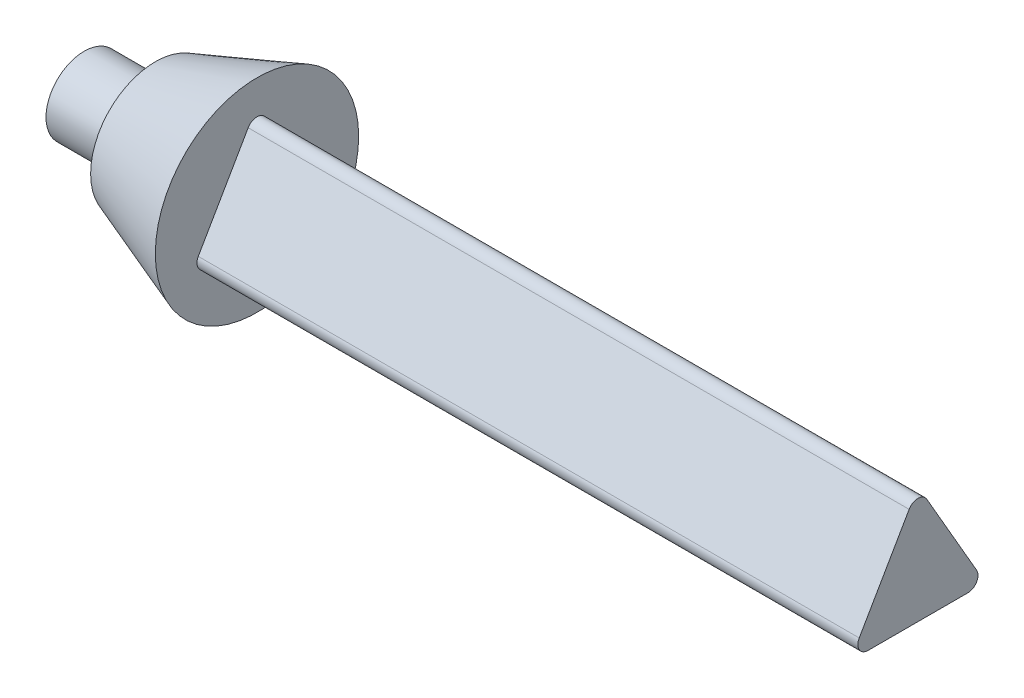
ISO-10303-21;
HEADER;
FILE_DESCRIPTION(('STEP AP214'),'2;1');
FILE_NAME('part.step','',(''),(''),'','','');
FILE_SCHEMA(('AUTOMOTIVE_DESIGN { 1 0 10303 214 1 1 1 1 }'));
ENDSEC;
DATA;
#1=APPLICATION_CONTEXT('core data for automotive mechanical design processes');
#2=APPLICATION_PROTOCOL_DEFINITION('international standard','automotive_design',2000,#1);
#3=PRODUCT_CONTEXT('',#1,'mechanical');
#4=PRODUCT('Part','Part','',(#3));
#5=PRODUCT_RELATED_PRODUCT_CATEGORY('part','',(#4));
#6=PRODUCT_DEFINITION_FORMATION('','',#4);
#7=PRODUCT_DEFINITION_CONTEXT('part definition',#1,'design');
#8=PRODUCT_DEFINITION('design','',#6,#7);
#9=PRODUCT_DEFINITION_SHAPE('','',#8);
#10=(LENGTH_UNIT() NAMED_UNIT(*) SI_UNIT(.MILLI.,.METRE.));
#11=(NAMED_UNIT(*) PLANE_ANGLE_UNIT() SI_UNIT($,.RADIAN.));
#12=(NAMED_UNIT(*) SI_UNIT($,.STERADIAN.) SOLID_ANGLE_UNIT());
#13=UNCERTAINTY_MEASURE_WITH_UNIT(LENGTH_MEASURE(1.E-05),#10,'distance_accuracy_value','');
#14=(GEOMETRIC_REPRESENTATION_CONTEXT(3) GLOBAL_UNCERTAINTY_ASSIGNED_CONTEXT((#13)) GLOBAL_UNIT_ASSIGNED_CONTEXT((#10,
#11,#12)) REPRESENTATION_CONTEXT('',''));
#15=CARTESIAN_POINT('',(0.,0.,0.));
#16=DIRECTION('',(0.,0.,1.));
#17=DIRECTION('',(1.,0.,0.));
#18=AXIS2_PLACEMENT_3D('',#15,#16,#17);
#19=CARTESIAN_POINT('',(0.,0.,0.));
#20=DIRECTION('',(-1.,0.,0.));
#21=DIRECTION('',(0.,0.,1.));
#22=AXIS2_PLACEMENT_3D('',#19,#20,#21);
#23=PLANE('',#22);
#24=CARTESIAN_POINT('',(0.,0.,0.));
#25=DIRECTION('',(-1.,0.,0.));
#26=DIRECTION('',(0.,0.,1.));
#27=AXIS2_PLACEMENT_3D('',#24,#25,#26);
#28=CIRCLE('',#27,2.);
#29=CARTESIAN_POINT('',(0.,0.,2.));
#30=VERTEX_POINT('',#29);
#31=EDGE_CURVE('E120',#30,#30,#28,.T.);
#32=ORIENTED_EDGE('',*,*,#31,.F.);
#33=EDGE_LOOP('',(#32));
#34=FACE_BOUND('',#33,.T.);
#35=DIRECTION('',(0.,0.866025403784438,0.5));
#36=VECTOR('',#35,1.);
#37=CARTESIAN_POINT('',(0.,-0.766666666666666,-1.32790561913614));
#38=LINE('',#37,#36);
#39=CARTESIAN_POINT('',(0.,-0.466666666666666,-1.15470053837925));
#40=VERTEX_POINT('',#39);
#41=CARTESIAN_POINT('',(0.,1.23333333333333,-0.173205080756888));
#42=VERTEX_POINT('',#41);
#43=EDGE_CURVE('E99',#40,#42,#38,.T.);
#44=ORIENTED_EDGE('',*,*,#43,.F.);
#45=CARTESIAN_POINT('',(0.,-0.566666666666666,-0.981495457622363));
#46=DIRECTION('',(-1.,0.,0.));
#47=DIRECTION('',(0.,0.,1.));
#48=AXIS2_PLACEMENT_3D('',#45,#46,#47);
#49=CIRCLE('',#48,0.2);
#50=CARTESIAN_POINT('',(0.,-0.766666666666666,-0.981495457622363));
#51=VERTEX_POINT('',#50);
#52=EDGE_CURVE('E85',#40,#51,#49,.T.);
#53=ORIENTED_EDGE('',*,*,#52,.T.);
#54=DIRECTION('',(0.,0.,-1.));
#55=VECTOR('',#54,1.);
#56=CARTESIAN_POINT('',(0.,-0.766666666666667,1.32790561913614));
#57=LINE('',#56,#55);
#58=CARTESIAN_POINT('',(0.,-0.766666666666666,0.981495457622363));
#59=VERTEX_POINT('',#58);
#60=EDGE_CURVE('E108',#59,#51,#57,.T.);
#61=ORIENTED_EDGE('',*,*,#60,.F.);
#62=CARTESIAN_POINT('',(0.,-0.566666666666667,0.981495457622363));
#63=DIRECTION('',(-1.,0.,0.));
#64=DIRECTION('',(0.,0.,1.));
#65=AXIS2_PLACEMENT_3D('',#62,#63,#64);
#66=CIRCLE('',#65,0.2);
#67=CARTESIAN_POINT('',(0.,-0.466666666666666,1.15470053837925));
#68=VERTEX_POINT('',#67);
#69=EDGE_CURVE('E11',#59,#68,#66,.T.);
#70=ORIENTED_EDGE('',*,*,#69,.T.);
#71=DIRECTION('',(0.,-0.866025403784439,0.5));
#72=VECTOR('',#71,1.);
#73=CARTESIAN_POINT('',(0.,1.53333333333333,0.));
#74=LINE('',#73,#72);
#75=CARTESIAN_POINT('',(0.,1.23333333333333,0.173205080756888));
#76=VERTEX_POINT('',#75);
#77=EDGE_CURVE('E105',#76,#68,#74,.T.);
#78=ORIENTED_EDGE('',*,*,#77,.F.);
#79=CARTESIAN_POINT('',(0.,1.13333333333333,0.));
#80=DIRECTION('',(-1.,0.,0.));
#81=DIRECTION('',(0.,0.,1.));
#82=AXIS2_PLACEMENT_3D('',#79,#80,#81);
#83=CIRCLE('',#82,0.2);
#84=EDGE_CURVE('E41',#76,#42,#83,.T.);
#85=ORIENTED_EDGE('',*,*,#84,.T.);
#86=EDGE_LOOP('',(#44,#53,#61,#70,#78,#85));
#87=FACE_BOUND('',#86,.T.);
#88=ADVANCED_FACE('F33',(#34,#87),#23,.F.);
#89=CARTESIAN_POINT('',(0.,0.,0.));
#90=DIRECTION('',(1.,0.,0.));
#91=DIRECTION('',(0.,0.,-1.));
#92=AXIS2_PLACEMENT_3D('',#89,#90,#91);
#93=CONICAL_SURFACE('',#92,2.,0.34906585039886);
#94=CARTESIAN_POINT('',(-2.,0.,0.));
#95=DIRECTION('',(-1.,0.,0.));
#96=DIRECTION('',(0.,0.,1.));
#97=AXIS2_PLACEMENT_3D('',#94,#95,#96);
#98=CIRCLE('',#97,1.27205953146761);
#99=CARTESIAN_POINT('',(-2.,0.,1.27205953146761));
#100=VERTEX_POINT('',#99);
#101=EDGE_CURVE('E117',#100,#100,#98,.T.);
#102=ORIENTED_EDGE('',*,*,#101,.F.);
#103=EDGE_LOOP('',(#102));
#104=FACE_BOUND('',#103,.T.);
#105=ORIENTED_EDGE('',*,*,#31,.T.);
#106=EDGE_LOOP('',(#105));
#107=FACE_BOUND('',#106,.T.);
#108=ADVANCED_FACE('F158',(#104,#107),#93,.T.);
#109=CARTESIAN_POINT('',(-2.,1.27205953146761,0.));
#110=DIRECTION('',(1.,0.,0.));
#111=DIRECTION('',(0.,0.,-1.));
#112=AXIS2_PLACEMENT_3D('',#109,#110,#111);
#113=PLANE('',#112);
#114=CARTESIAN_POINT('',(-2.,0.,0.));
#115=DIRECTION('',(-1.,0.,0.));
#116=DIRECTION('',(0.,0.,1.));
#117=AXIS2_PLACEMENT_3D('',#114,#115,#116);
#118=CIRCLE('',#117,0.75);
#119=CARTESIAN_POINT('',(-2.,0.,0.75));
#120=VERTEX_POINT('',#119);
#121=EDGE_CURVE('E123',#120,#120,#118,.T.);
#122=ORIENTED_EDGE('',*,*,#121,.F.);
#123=EDGE_LOOP('',(#122));
#124=FACE_BOUND('',#123,.T.);
#125=ORIENTED_EDGE('',*,*,#101,.T.);
#126=EDGE_LOOP('',(#125));
#127=FACE_BOUND('',#126,.T.);
#128=ADVANCED_FACE('F155',(#124,#127),#113,.F.);
#129=CARTESIAN_POINT('',(13.,-0.766666666666666,-1.32790561913614));
#130=DIRECTION('',(0.,-0.5,0.866025403784438));
#131=DIRECTION('',(0.,-0.866025403784439,-0.5));
#132=AXIS2_PLACEMENT_3D('',#129,#130,#131);
#133=PLANE('',#132);
#134=DIRECTION('',(0.,0.866025403784438,0.5));
#135=VECTOR('',#134,1.);
#136=CARTESIAN_POINT('',(13.,-0.766666666666666,-1.32790561913614));
#137=LINE('',#136,#135);
#138=CARTESIAN_POINT('',(13.,-0.466666666666666,-1.15470053837925));
#139=VERTEX_POINT('',#138);
#140=CARTESIAN_POINT('',(13.,1.23333333333333,-0.173205080756888));
#141=VERTEX_POINT('',#140);
#142=EDGE_CURVE('E101',#139,#141,#137,.T.);
#143=ORIENTED_EDGE('',*,*,#142,.F.);
#144=DIRECTION('',(-1.,0.,0.));
#145=VECTOR('',#144,1.);
#146=CARTESIAN_POINT('',(13.,-0.466666666666666,-1.15470053837925));
#147=LINE('',#146,#145);
#148=EDGE_CURVE('E89',#139,#40,#147,.T.);
#149=ORIENTED_EDGE('',*,*,#148,.T.);
#150=ORIENTED_EDGE('',*,*,#43,.T.);
#151=DIRECTION('',(-1.,0.,0.));
#152=VECTOR('',#151,1.);
#153=CARTESIAN_POINT('',(13.,1.23333333333333,-0.173205080756887));
#154=LINE('',#153,#152);
#155=EDGE_CURVE('E103',#42,#141,#154,.F.);
#156=ORIENTED_EDGE('',*,*,#155,.T.);
#157=EDGE_LOOP('',(#143,#149,#150,#156));
#158=FACE_BOUND('',#157,.T.);
#159=ADVANCED_FACE('F98',(#158),#133,.F.);
#160=CARTESIAN_POINT('',(13.,1.53333333333333,0.));
#161=DIRECTION('',(0.,-0.5,-0.866025403784439));
#162=DIRECTION('',(0.,0.866025403784439,-0.5));
#163=AXIS2_PLACEMENT_3D('',#160,#161,#162);
#164=PLANE('',#163);
#165=DIRECTION('',(0.,-0.866025403784439,0.5));
#166=VECTOR('',#165,1.);
#167=CARTESIAN_POINT('',(13.,1.53333333333333,0.));
#168=LINE('',#167,#166);
#169=CARTESIAN_POINT('',(13.,1.23333333333333,0.173205080756888));
#170=VERTEX_POINT('',#169);
#171=CARTESIAN_POINT('',(13.,-0.466666666666666,1.15470053837925));
#172=VERTEX_POINT('',#171);
#173=EDGE_CURVE('E141',#170,#172,#168,.T.);
#174=ORIENTED_EDGE('',*,*,#173,.F.);
#175=DIRECTION('',(-1.,0.,0.));
#176=VECTOR('',#175,1.);
#177=CARTESIAN_POINT('',(13.,1.23333333333333,0.173205080756888));
#178=LINE('',#177,#176);
#179=EDGE_CURVE('E93',#170,#76,#178,.T.);
#180=ORIENTED_EDGE('',*,*,#179,.T.);
#181=ORIENTED_EDGE('',*,*,#77,.T.);
#182=DIRECTION('',(-1.,0.,0.));
#183=VECTOR('',#182,1.);
#184=CARTESIAN_POINT('',(13.,-0.466666666666666,1.15470053837925));
#185=LINE('',#184,#183);
#186=EDGE_CURVE('E134',#68,#172,#185,.F.);
#187=ORIENTED_EDGE('',*,*,#186,.T.);
#188=EDGE_LOOP('',(#174,#180,#181,#187));
#189=FACE_BOUND('',#188,.T.);
#190=ADVANCED_FACE('F138',(#189),#164,.F.);
#191=CARTESIAN_POINT('',(13.,-0.766666666666667,1.32790561913614));
#192=DIRECTION('',(0.,1.,0.));
#193=DIRECTION('',(0.,0.,1.));
#194=AXIS2_PLACEMENT_3D('',#191,#192,#193);
#195=PLANE('',#194);
#196=ORIENTED_EDGE('',*,*,#60,.T.);
#197=DIRECTION('',(-1.,0.,0.));
#198=VECTOR('',#197,1.);
#199=CARTESIAN_POINT('',(13.,-0.766666666666666,-0.981495457622363));
#200=LINE('',#199,#198);
#201=CARTESIAN_POINT('',(13.,-0.766666666666666,-0.981495457622363));
#202=VERTEX_POINT('',#201);
#203=EDGE_CURVE('E90',#51,#202,#200,.F.);
#204=ORIENTED_EDGE('',*,*,#203,.T.);
#205=DIRECTION('',(0.,0.,-1.));
#206=VECTOR('',#205,1.);
#207=CARTESIAN_POINT('',(13.,-0.766666666666667,1.32790561913614));
#208=LINE('',#207,#206);
#209=CARTESIAN_POINT('',(13.,-0.766666666666666,0.981495457622363));
#210=VERTEX_POINT('',#209);
#211=EDGE_CURVE('E113',#210,#202,#208,.T.);
#212=ORIENTED_EDGE('',*,*,#211,.F.);
#213=DIRECTION('',(-1.,0.,0.));
#214=VECTOR('',#213,1.);
#215=CARTESIAN_POINT('',(13.,-0.766666666666666,0.981495457622363));
#216=LINE('',#215,#214);
#217=EDGE_CURVE('E102',#210,#59,#216,.T.);
#218=ORIENTED_EDGE('',*,*,#217,.T.);
#219=EDGE_LOOP('',(#196,#204,#212,#218));
#220=FACE_BOUND('',#219,.T.);
#221=ADVANCED_FACE('F184',(#220),#195,.F.);
#222=CARTESIAN_POINT('',(13.,0.,0.));
#223=DIRECTION('',(1.,0.,0.));
#224=DIRECTION('',(0.,0.,-1.));
#225=AXIS2_PLACEMENT_3D('',#222,#223,#224);
#226=PLANE('',#225);
#227=ORIENTED_EDGE('',*,*,#211,.T.);
#228=CARTESIAN_POINT('',(13.,-0.566666666666666,-0.981495457622363));
#229=DIRECTION('',(1.,0.,0.));
#230=DIRECTION('',(0.,0.,-1.));
#231=AXIS2_PLACEMENT_3D('',#228,#229,#230);
#232=CIRCLE('',#231,0.2);
#233=EDGE_CURVE('E132',#202,#139,#232,.T.);
#234=ORIENTED_EDGE('',*,*,#233,.T.);
#235=ORIENTED_EDGE('',*,*,#142,.T.);
#236=CARTESIAN_POINT('',(13.,1.13333333333333,0.));
#237=DIRECTION('',(1.,0.,0.));
#238=DIRECTION('',(0.,0.,-1.));
#239=AXIS2_PLACEMENT_3D('',#236,#237,#238);
#240=CIRCLE('',#239,0.2);
#241=EDGE_CURVE('E130',#141,#170,#240,.T.);
#242=ORIENTED_EDGE('',*,*,#241,.T.);
#243=ORIENTED_EDGE('',*,*,#173,.T.);
#244=CARTESIAN_POINT('',(13.,-0.566666666666667,0.981495457622363));
#245=DIRECTION('',(1.,0.,0.));
#246=DIRECTION('',(0.,0.,-1.));
#247=AXIS2_PLACEMENT_3D('',#244,#245,#246);
#248=CIRCLE('',#247,0.2);
#249=EDGE_CURVE('E128',#172,#210,#248,.T.);
#250=ORIENTED_EDGE('',*,*,#249,.T.);
#251=EDGE_LOOP('',(#227,#234,#235,#242,#243,#250));
#252=FACE_BOUND('',#251,.T.);
#253=ADVANCED_FACE('F146',(#252),#226,.T.);
#254=CARTESIAN_POINT('',(-3.4,0.,0.));
#255=DIRECTION('',(1.,0.,0.));
#256=DIRECTION('',(0.,0.,-1.));
#257=AXIS2_PLACEMENT_3D('',#254,#255,#256);
#258=CYLINDRICAL_SURFACE('',#257,0.75);
#259=CARTESIAN_POINT('',(-3.4,0.,0.));
#260=DIRECTION('',(-1.,0.,0.));
#261=DIRECTION('',(0.,0.,1.));
#262=AXIS2_PLACEMENT_3D('',#259,#260,#261);
#263=CIRCLE('',#262,0.75);
#264=CARTESIAN_POINT('',(-3.4,0.,0.75));
#265=VERTEX_POINT('',#264);
#266=EDGE_CURVE('E106',#265,#265,#263,.T.);
#267=ORIENTED_EDGE('',*,*,#266,.F.);
#268=EDGE_LOOP('',(#267));
#269=FACE_BOUND('',#268,.T.);
#270=ORIENTED_EDGE('',*,*,#121,.T.);
#271=EDGE_LOOP('',(#270));
#272=FACE_BOUND('',#271,.T.);
#273=ADVANCED_FACE('F153',(#269,#272),#258,.T.);
#274=CARTESIAN_POINT('',(-3.4,0.,0.));
#275=DIRECTION('',(-1.,0.,0.));
#276=DIRECTION('',(0.,0.,1.));
#277=AXIS2_PLACEMENT_3D('',#274,#275,#276);
#278=PLANE('',#277);
#279=ORIENTED_EDGE('',*,*,#266,.T.);
#280=EDGE_LOOP('',(#279));
#281=FACE_BOUND('',#280,.T.);
#282=ADVANCED_FACE('F173',(#281),#278,.T.);
#283=CARTESIAN_POINT('',(13.,-0.566666666666666,-0.981495457622363));
#284=DIRECTION('',(-1.,0.,0.));
#285=DIRECTION('',(0.,0.,1.));
#286=AXIS2_PLACEMENT_3D('',#283,#284,#285);
#287=CYLINDRICAL_SURFACE('',#286,0.2);
#288=ORIENTED_EDGE('',*,*,#233,.F.);
#289=ORIENTED_EDGE('',*,*,#203,.F.);
#290=ORIENTED_EDGE('',*,*,#52,.F.);
#291=ORIENTED_EDGE('',*,*,#148,.F.);
#292=EDGE_LOOP('',(#288,#289,#290,#291));
#293=FACE_BOUND('',#292,.T.);
#294=ADVANCED_FACE('F88',(#293),#287,.T.);
#295=CARTESIAN_POINT('',(13.,1.13333333333333,0.));
#296=DIRECTION('',(-1.,0.,0.));
#297=DIRECTION('',(0.,0.,1.));
#298=AXIS2_PLACEMENT_3D('',#295,#296,#297);
#299=CYLINDRICAL_SURFACE('',#298,0.2);
#300=ORIENTED_EDGE('',*,*,#241,.F.);
#301=ORIENTED_EDGE('',*,*,#155,.F.);
#302=ORIENTED_EDGE('',*,*,#84,.F.);
#303=ORIENTED_EDGE('',*,*,#179,.F.);
#304=EDGE_LOOP('',(#300,#301,#302,#303));
#305=FACE_BOUND('',#304,.T.);
#306=ADVANCED_FACE('F143',(#305),#299,.T.);
#307=CARTESIAN_POINT('',(13.,-0.566666666666667,0.981495457622363));
#308=DIRECTION('',(-1.,0.,0.));
#309=DIRECTION('',(0.,0.,1.));
#310=AXIS2_PLACEMENT_3D('',#307,#308,#309);
#311=CYLINDRICAL_SURFACE('',#310,0.2);
#312=ORIENTED_EDGE('',*,*,#249,.F.);
#313=ORIENTED_EDGE('',*,*,#186,.F.);
#314=ORIENTED_EDGE('',*,*,#69,.F.);
#315=ORIENTED_EDGE('',*,*,#217,.F.);
#316=EDGE_LOOP('',(#312,#313,#314,#315));
#317=FACE_BOUND('',#316,.T.);
#318=ADVANCED_FACE('F35',(#317),#311,.T.);
#319=CLOSED_SHELL('',(#88,#108,#128,#159,#190,#221,#253,#273,#282,#294,#306,#318));
#320=MANIFOLD_SOLID_BREP('B2',#319);
#321=ADVANCED_BREP_SHAPE_REPRESENTATION('',(#18,#320),#14);
#322=SHAPE_DEFINITION_REPRESENTATION(#9,#321);
ENDSEC;
END-ISO-10303-21;
